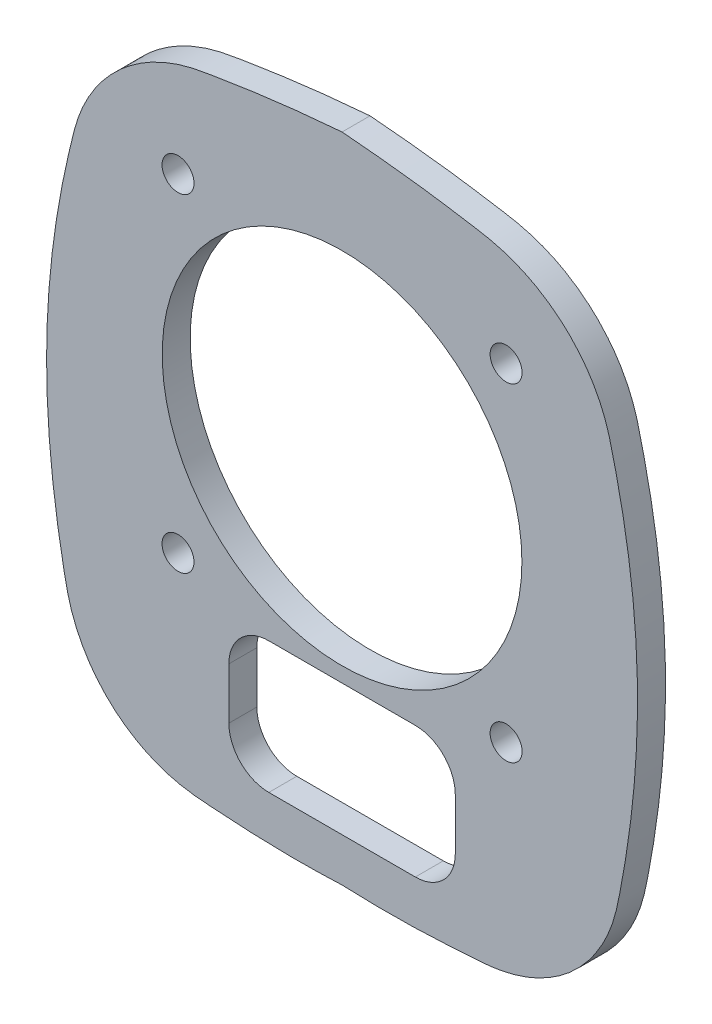
ISO-10303-21;
HEADER;
FILE_DESCRIPTION(('STEP AP214'),'2;1');
FILE_NAME('part.step','',(''),(''),'','','');
FILE_SCHEMA(('AUTOMOTIVE_DESIGN { 1 0 10303 214 1 1 1 1 }'));
ENDSEC;
DATA;
#1=APPLICATION_CONTEXT('core data for automotive mechanical design processes');
#2=APPLICATION_PROTOCOL_DEFINITION('international standard','automotive_design',2000,#1);
#3=PRODUCT_CONTEXT('',#1,'mechanical');
#4=PRODUCT('Part','Part','',(#3));
#5=PRODUCT_RELATED_PRODUCT_CATEGORY('part','',(#4));
#6=PRODUCT_DEFINITION_FORMATION('','',#4);
#7=PRODUCT_DEFINITION_CONTEXT('part definition',#1,'design');
#8=PRODUCT_DEFINITION('design','',#6,#7);
#9=PRODUCT_DEFINITION_SHAPE('','',#8);
#10=(LENGTH_UNIT() NAMED_UNIT(*) SI_UNIT(.MILLI.,.METRE.));
#11=(NAMED_UNIT(*) PLANE_ANGLE_UNIT() SI_UNIT($,.RADIAN.));
#12=(NAMED_UNIT(*) SI_UNIT($,.STERADIAN.) SOLID_ANGLE_UNIT());
#13=UNCERTAINTY_MEASURE_WITH_UNIT(LENGTH_MEASURE(1.E-05),#10,'distance_accuracy_value','');
#14=(GEOMETRIC_REPRESENTATION_CONTEXT(3) GLOBAL_UNCERTAINTY_ASSIGNED_CONTEXT((#13)) GLOBAL_UNIT_ASSIGNED_CONTEXT((#10,
#11,#12)) REPRESENTATION_CONTEXT('',''));
#15=CARTESIAN_POINT('',(0.,0.,0.));
#16=DIRECTION('',(0.,0.,1.));
#17=DIRECTION('',(1.,0.,0.));
#18=AXIS2_PLACEMENT_3D('',#15,#16,#17);
#19=CARTESIAN_POINT('',(29.5660110526599,98.2723507811862,1.4));
#20=DIRECTION('',(0.,0.,-1.));
#21=DIRECTION('',(-1.,0.,0.));
#22=AXIS2_PLACEMENT_3D('',#19,#20,#21);
#23=PLANE('',#22);
#24=CARTESIAN_POINT('',(16.4175490307704,87.21939598985,1.4));
#25=DIRECTION('',(0.,0.,1.));
#26=DIRECTION('',(-1.,0.,0.));
#27=AXIS2_PLACEMENT_3D('',#24,#25,#26);
#28=CIRCLE('',#27,1.6);
#29=CARTESIAN_POINT('',(14.8175490307704,87.21939598985,1.4));
#30=VERTEX_POINT('',#29);
#31=EDGE_CURVE('E207',#30,#30,#28,.T.);
#32=ORIENTED_EDGE('',*,*,#31,.F.);
#33=EDGE_LOOP('',(#32));
#34=FACE_BOUND('',#33,.T.);
#35=CARTESIAN_POINT('',(16.4175490307704,120.054494051391,1.4));
#36=DIRECTION('',(0.,0.,1.));
#37=DIRECTION('',(1.,0.,0.));
#38=AXIS2_PLACEMENT_3D('',#35,#36,#37);
#39=CIRCLE('',#38,1.6);
#40=CARTESIAN_POINT('',(18.0175490307704,120.054494051391,1.4));
#41=VERTEX_POINT('',#40);
#42=EDGE_CURVE('E215',#41,#41,#39,.T.);
#43=ORIENTED_EDGE('',*,*,#42,.F.);
#44=EDGE_LOOP('',(#43));
#45=FACE_BOUND('',#44,.T.);
#46=CARTESIAN_POINT('',(-16.4167663836786,87.21939598985,1.4));
#47=DIRECTION('',(0.,0.,1.));
#48=DIRECTION('',(1.,0.,0.));
#49=AXIS2_PLACEMENT_3D('',#46,#47,#48);
#50=CIRCLE('',#49,1.6);
#51=CARTESIAN_POINT('',(-14.8167663836786,87.21939598985,1.4));
#52=VERTEX_POINT('',#51);
#53=EDGE_CURVE('E223',#52,#52,#50,.T.);
#54=ORIENTED_EDGE('',*,*,#53,.F.);
#55=EDGE_LOOP('',(#54));
#56=FACE_BOUND('',#55,.T.);
#57=CARTESIAN_POINT('',(-16.4167663836786,120.054494051391,1.4));
#58=DIRECTION('',(0.,0.,1.));
#59=DIRECTION('',(-1.,0.,0.));
#60=AXIS2_PLACEMENT_3D('',#57,#58,#59);
#61=CIRCLE('',#60,1.6);
#62=CARTESIAN_POINT('',(-18.0167663836786,120.054494051391,1.4));
#63=VERTEX_POINT('',#62);
#64=EDGE_CURVE('E231',#63,#63,#61,.T.);
#65=ORIENTED_EDGE('',*,*,#64,.F.);
#66=EDGE_LOOP('',(#65));
#67=FACE_BOUND('',#66,.T.);
#68=CARTESIAN_POINT('',(0.,103.636945020621,1.4));
#69=DIRECTION('',(0.,0.,1.));
#70=DIRECTION('',(1.,0.,0.));
#71=AXIS2_PLACEMENT_3D('',#68,#69,#70);
#72=CIRCLE('',#71,18.);
#73=CARTESIAN_POINT('',(18.,103.636945020621,1.4));
#74=VERTEX_POINT('',#73);
#75=EDGE_CURVE('E239',#74,#74,#72,.T.);
#76=ORIENTED_EDGE('',*,*,#75,.F.);
#77=EDGE_LOOP('',(#76));
#78=FACE_BOUND('',#77,.T.);
#79=CARTESIAN_POINT('',(-0.00114590293324403,66.6423887461975,1.4));
#80=CARTESIAN_POINT('',(2.16948562826334,66.5419398633062,1.4));
#81=CARTESIAN_POINT('',(5.43385116812683,66.505280538818,1.4));
#82=CARTESIAN_POINT('',(9.77200299351558,66.6566452224753,1.4));
#83=CARTESIAN_POINT('',(12.4817460876061,66.8356540688409,1.4));
#84=CARTESIAN_POINT('',(14.637680558828,66.983895816478,1.4));
#85=CARTESIAN_POINT('',(16.9129124050583,67.3234824873819,1.4));
#86=CARTESIAN_POINT('',(19.6236468631734,68.2455656210694,1.4));
#87=CARTESIAN_POINT('',(22.5464740169098,70.0824830868816,1.4));
#88=CARTESIAN_POINT('',(24.9502766875692,72.5730299108774,1.4));
#89=CARTESIAN_POINT('',(26.3989798043547,75.0504166052951,1.4));
#90=CARTESIAN_POINT('',(27.2065581908342,77.1786683050761,1.4));
#91=CARTESIAN_POINT('',(27.6110183961039,78.8487852280131,1.4));
#92=CARTESIAN_POINT('',(27.9093681702662,80.4300199858868,1.4));
#93=CARTESIAN_POINT('',(28.3025005898399,82.5729718823645,1.4));
#94=CARTESIAN_POINT('',(28.7205415588727,85.2543199128912,1.4));
#95=CARTESIAN_POINT('',(29.1181558415916,88.4931280297747,1.4));
#96=CARTESIAN_POINT('',(29.4903901876357,92.8280904478494,1.4));
#97=CARTESIAN_POINT('',(29.654253142288,98.2732628435648,1.4));
#98=CARTESIAN_POINT('',(29.3769056487996,103.713874927387,1.4));
#99=CARTESIAN_POINT('',(28.8956423277796,108.042477970134,1.4));
#100=CARTESIAN_POINT('',(28.4052762156834,111.270056639962,1.4));
#101=CARTESIAN_POINT('',(27.7967621601101,114.480280638573,1.4));
#102=CARTESIAN_POINT('',(27.1834847934858,117.116721421864,1.4));
#103=CARTESIAN_POINT('',(26.6675524143798,119.250806558587,1.4));
#104=CARTESIAN_POINT('',(25.8901295661733,121.416071799771,1.4));
#105=CARTESIAN_POINT('',(24.4734859452568,123.902459514448,1.4));
#106=CARTESIAN_POINT('',(22.1547118273897,126.445270684915,1.4));
#107=CARTESIAN_POINT('',(19.342461396647,128.415820489186,1.4));
#108=CARTESIAN_POINT('',(16.7314740172919,129.527353104295,1.4));
#109=CARTESIAN_POINT('',(14.509433763638,130.079191823248,1.4));
#110=CARTESIAN_POINT('',(12.3644948862494,130.418554538151,1.4));
#111=CARTESIAN_POINT('',(9.69261830244954,130.848121131598,1.4));
#112=CARTESIAN_POINT('',(5.39273250940411,131.419070179077,1.4));
#113=CARTESIAN_POINT('',(2.15936510859775,131.732517865312,1.4));
#114=CARTESIAN_POINT('',(0.000391323545911014,131.908854892588,1.4));
#115=B_SPLINE_CURVE_WITH_KNOTS('',3,(#79,#80,#81,#82,#83,#84,#85,#86,#87,#88,#89,#90,#91,#92,
#93,#94,#95,#96,#97,#98,#99,#100,#101,#102,#103,#104,#105,#106,#107,#108,#109,#110,#111,#112,
#113,#114),.UNSPECIFIED.,.F.,.F.,(4,1,1,1,1,1,1,1,1,1,1,1,1,1,1,1,1,1,1,1,1,1,1,1,1,1,1,1,1,1,1,
1,1,4),(0.000346796991259824,0.0628643634976953,0.094123146750913,0.125381930004131,
0.14101132163074,0.156640713257348,0.187899496510566,0.219158279763784,0.250417063017002,
0.281675846270219,0.297305237896828,0.312934629523437,0.328564021150046,0.344193412776655,
0.375452196029872,0.40671097928309,0.437969762536308,0.500487329042743,0.563004895549179,
0.594263678802396,0.625522462055614,0.656781245308832,0.68804002856205,0.703669420188658,
0.719298811815267,0.750557595068485,0.781816378321703,0.813075161574921,0.844333944828138,
0.859963336454747,0.875592728081356,0.906851511334574,0.938110294587791,1.00062786109423),.UNSPECIFIED.);
#116=CARTESIAN_POINT('',(-0.00114590293391867,66.6423887461975,1.4));
#117=VERTEX_POINT('',#116);
#118=CARTESIAN_POINT('',(0.000391323546145079,131.908854892588,1.4));
#119=VERTEX_POINT('',#118);
#120=EDGE_CURVE('E246',#117,#119,#115,.T.);
#121=ORIENTED_EDGE('',*,*,#120,.T.);
#122=CARTESIAN_POINT('',(0.000391323546145079,131.908854892588,1.4));
#123=CARTESIAN_POINT('',(-2.1591261383784,131.7345930861,1.4));
#124=CARTESIAN_POINT('',(-5.39322742901257,131.418538240011,1.4));
#125=CARTESIAN_POINT('',(-9.69289483410496,130.848188184135,1.4));
#126=CARTESIAN_POINT('',(-12.3658250185179,130.418323908694,1.4));
#127=CARTESIAN_POINT('',(-14.5079914346973,130.079334896995,1.4));
#128=CARTESIAN_POINT('',(-16.7335790717156,129.5269106605,1.4));
#129=CARTESIAN_POINT('',(-19.3431914714866,128.415144728243,1.4));
#130=CARTESIAN_POINT('',(-22.1552988711551,126.445152242459,1.4));
#131=CARTESIAN_POINT('',(-24.4752364303285,123.899413855855,1.4));
#132=CARTESIAN_POINT('',(-25.887781921426,121.420218381764,1.4));
#133=CARTESIAN_POINT('',(-26.6662140206921,119.255985971513,1.4));
#134=CARTESIAN_POINT('',(-27.1828375186665,117.119607320457,1.4));
#135=CARTESIAN_POINT('',(-27.7958816228897,114.484316509087,1.4));
#136=CARTESIAN_POINT('',(-28.4047206131908,111.2734495972,1.4));
#137=CARTESIAN_POINT('',(-28.8951748287373,108.045870015957,1.4));
#138=CARTESIAN_POINT('',(-29.3766911011961,103.716956362817,1.4));
#139=CARTESIAN_POINT('',(-29.6542181670158,98.2761183571566,1.4));
#140=CARTESIAN_POINT('',(-29.4905112309064,92.8305844065659,1.4));
#141=CARTESIAN_POINT('',(-29.1184365267498,88.4954449681171,1.4));
#142=CARTESIAN_POINT('',(-28.7206832439652,85.256152796539,1.4));
#143=CARTESIAN_POINT('',(-28.3032264117914,82.5755819784739,1.4));
#144=CARTESIAN_POINT('',(-27.9089571505932,80.4308811818363,1.4));
#145=CARTESIAN_POINT('',(-27.6123180213739,78.8489960258506,1.4));
#146=CARTESIAN_POINT('',(-27.2069901770556,77.1815747696189,1.4));
#147=CARTESIAN_POINT('',(-26.3998073250248,75.0513159005706,1.4));
#148=CARTESIAN_POINT('',(-24.9513512481695,72.5746001415276,1.4));
#149=CARTESIAN_POINT('',(-22.5477231757786,70.0835207878265,1.4));
#150=CARTESIAN_POINT('',(-19.6247167325254,68.2459568509885,1.4));
#151=CARTESIAN_POINT('',(-16.9138564153532,67.3239214153239,1.4));
#152=CARTESIAN_POINT('',(-14.6389200212343,66.9838066691267,1.4));
#153=CARTESIAN_POINT('',(-12.4812620448513,66.8357081274828,1.4));
#154=CARTESIAN_POINT('',(-9.77299519971555,66.656339600391,1.4));
#155=CARTESIAN_POINT('',(-6.51861540533435,66.5443130204577,1.4));
#156=CARTESIAN_POINT('',(-3.25841317832526,66.5253695638279,1.4));
#157=CARTESIAN_POINT('',(-1.08648271210071,66.5952706153703,1.4));
#158=CARTESIAN_POINT('',(-0.00114590293391867,66.6423887461975,1.4));
#159=B_SPLINE_CURVE_WITH_KNOTS('',3,(#122,#123,#124,#125,#126,#127,#128,#129,#130,#131,#132,
#133,#134,#135,#136,#137,#138,#139,#140,#141,#142,#143,#144,#145,#146,#147,#148,#149,#150,#151,
#152,#153,#154,#155,#156,#157,#158),.UNSPECIFIED.,.F.,.F.,(4,1,1,1,1,1,1,1,1,1,1,1,1,1,1,1,1,1,
1,1,1,1,1,1,1,1,1,1,1,1,1,1,1,1,4),(-0.000627828320434477,0.0618897355672235,0.0931485175110524,
0.124407299454881,0.140036690426796,0.15566608139871,0.186924863342539,0.218183645286368,
0.249442427230197,0.280701209174026,0.296330600145941,0.311959991117855,0.343218773061684,
0.374477555005513,0.405736336949342,0.436995118893171,0.499512682780829,0.562030246668487,
0.593289028612316,0.624547810556145,0.655806592499974,0.671435983471888,0.687065374443803,
0.702694765415717,0.718324156387632,0.749582938331461,0.78084172027529,0.812100502219119,
0.843359284162948,0.858988675134862,0.874618066106777,0.905876848050606,0.937135629994435,
0.968394411938263,0.999653193882093),.UNSPECIFIED.);
#160=EDGE_CURVE('E253',#119,#117,#159,.T.);
#161=ORIENTED_EDGE('',*,*,#160,.T.);
#162=EDGE_LOOP('',(#121,#161));
#163=FACE_BOUND('',#162,.T.);
#164=CARTESIAN_POINT('',(7.33166518277673,80.1435470663297,1.4));
#165=DIRECTION('',(0.,0.,1.));
#166=DIRECTION('',(-1.,0.,0.));
#167=AXIS2_PLACEMENT_3D('',#164,#165,#166);
#168=CIRCLE('',#167,4.);
#169=CARTESIAN_POINT('',(11.3316651827767,80.1435470663297,1.4));
#170=VERTEX_POINT('',#169);
#171=CARTESIAN_POINT('',(7.3316651827767,84.1435470663297,1.4));
#172=VERTEX_POINT('',#171);
#173=EDGE_CURVE('E118',#170,#172,#168,.T.);
#174=ORIENTED_EDGE('',*,*,#173,.F.);
#175=DIRECTION('',(0.,1.,0.));
#176=VECTOR('',#175,1.);
#177=CARTESIAN_POINT('',(11.3316651827767,75.002350727066,1.4));
#178=LINE('',#177,#176);
#179=CARTESIAN_POINT('',(11.3316651827767,75.002350727066,1.4));
#180=VERTEX_POINT('',#179);
#181=EDGE_CURVE('E159',#180,#170,#178,.T.);
#182=ORIENTED_EDGE('',*,*,#181,.F.);
#183=CARTESIAN_POINT('',(7.33166518277673,75.002350727066,1.4));
#184=DIRECTION('',(0.,0.,1.));
#185=DIRECTION('',(1.,0.,0.));
#186=AXIS2_PLACEMENT_3D('',#183,#184,#185);
#187=CIRCLE('',#186,4.);
#188=CARTESIAN_POINT('',(7.3316651827767,71.002350727066,1.4));
#189=VERTEX_POINT('',#188);
#190=EDGE_CURVE('E156',#189,#180,#187,.T.);
#191=ORIENTED_EDGE('',*,*,#190,.F.);
#192=DIRECTION('',(1.,0.,0.));
#193=VECTOR('',#192,1.);
#194=CARTESIAN_POINT('',(-7.33088253568488,71.002350727066,1.4));
#195=LINE('',#194,#193);
#196=CARTESIAN_POINT('',(-7.33088253568488,71.002350727066,1.4));
#197=VERTEX_POINT('',#196);
#198=EDGE_CURVE('E153',#197,#189,#195,.T.);
#199=ORIENTED_EDGE('',*,*,#198,.F.);
#200=CARTESIAN_POINT('',(-7.33088253568491,75.002350727066,1.4));
#201=DIRECTION('',(0.,0.,1.));
#202=DIRECTION('',(-1.,0.,0.));
#203=AXIS2_PLACEMENT_3D('',#200,#201,#202);
#204=CIRCLE('',#203,4.);
#205=CARTESIAN_POINT('',(-11.3308825356849,75.002350727066,1.4));
#206=VERTEX_POINT('',#205);
#207=EDGE_CURVE('E150',#206,#197,#204,.T.);
#208=ORIENTED_EDGE('',*,*,#207,.F.);
#209=DIRECTION('',(0.,-1.,0.));
#210=VECTOR('',#209,1.);
#211=CARTESIAN_POINT('',(-11.3308825356849,75.002350727066,1.4));
#212=LINE('',#211,#210);
#213=CARTESIAN_POINT('',(-11.3308825356849,80.1435470663297,1.4));
#214=VERTEX_POINT('',#213);
#215=EDGE_CURVE('E145',#214,#206,#212,.T.);
#216=ORIENTED_EDGE('',*,*,#215,.F.);
#217=CARTESIAN_POINT('',(-7.33088253568491,80.1435470663297,1.4));
#218=DIRECTION('',(0.,0.,1.));
#219=DIRECTION('',(-1.,0.,0.));
#220=AXIS2_PLACEMENT_3D('',#217,#218,#219);
#221=CIRCLE('',#220,4.);
#222=CARTESIAN_POINT('',(-7.33088253568488,84.1435470663297,1.4));
#223=VERTEX_POINT('',#222);
#224=EDGE_CURVE('E141',#223,#214,#221,.T.);
#225=ORIENTED_EDGE('',*,*,#224,.F.);
#226=DIRECTION('',(-1.,0.,0.));
#227=VECTOR('',#226,1.);
#228=CARTESIAN_POINT('',(-7.33088253568488,84.1435470663297,1.4));
#229=LINE('',#228,#227);
#230=EDGE_CURVE('E127',#172,#223,#229,.T.);
#231=ORIENTED_EDGE('',*,*,#230,.F.);
#232=EDGE_LOOP('',(#174,#182,#191,#199,#208,#216,#225,#231));
#233=FACE_BOUND('',#232,.T.);
#234=ADVANCED_FACE('F39',(#34,#45,#56,#67,#78,#163,#233),#23,.F.);
#235=CARTESIAN_POINT('',(29.5660110526599,98.2723507811862,-1.4));
#236=DIRECTION('',(0.,0.,-1.));
#237=DIRECTION('',(-1.,0.,0.));
#238=AXIS2_PLACEMENT_3D('',#235,#236,#237);
#239=PLANE('',#238);
#240=CARTESIAN_POINT('',(16.4175490307704,120.054494051391,-1.4));
#241=DIRECTION('',(0.,0.,1.));
#242=DIRECTION('',(1.,0.,0.));
#243=AXIS2_PLACEMENT_3D('',#240,#241,#242);
#244=CIRCLE('',#243,1.6);
#245=CARTESIAN_POINT('',(18.0175490307704,120.054494051391,-1.4));
#246=VERTEX_POINT('',#245);
#247=EDGE_CURVE('E211',#246,#246,#244,.T.);
#248=ORIENTED_EDGE('',*,*,#247,.T.);
#249=EDGE_LOOP('',(#248));
#250=FACE_BOUND('',#249,.T.);
#251=CARTESIAN_POINT('',(-16.4167663836786,120.054494051391,-1.4));
#252=DIRECTION('',(0.,0.,1.));
#253=DIRECTION('',(-1.,0.,0.));
#254=AXIS2_PLACEMENT_3D('',#251,#252,#253);
#255=CIRCLE('',#254,1.6);
#256=CARTESIAN_POINT('',(-18.0167663836786,120.054494051391,-1.4));
#257=VERTEX_POINT('',#256);
#258=EDGE_CURVE('E227',#257,#257,#255,.T.);
#259=ORIENTED_EDGE('',*,*,#258,.T.);
#260=EDGE_LOOP('',(#259));
#261=FACE_BOUND('',#260,.T.);
#262=CARTESIAN_POINT('',(-0.00114590293324403,66.6423887461975,-1.4));
#263=CARTESIAN_POINT('',(2.16948562826334,66.5419398633062,-1.4));
#264=CARTESIAN_POINT('',(5.43385116812683,66.505280538818,-1.4));
#265=CARTESIAN_POINT('',(9.77200299351558,66.6566452224753,-1.4));
#266=CARTESIAN_POINT('',(12.4817460876061,66.8356540688409,-1.4));
#267=CARTESIAN_POINT('',(14.637680558828,66.983895816478,-1.4));
#268=CARTESIAN_POINT('',(16.9129124050583,67.3234824873819,-1.4));
#269=CARTESIAN_POINT('',(19.6236468631734,68.2455656210694,-1.4));
#270=CARTESIAN_POINT('',(22.5464740169098,70.0824830868816,-1.4));
#271=CARTESIAN_POINT('',(24.9502766875692,72.5730299108774,-1.4));
#272=CARTESIAN_POINT('',(26.3989798043547,75.0504166052951,-1.4));
#273=CARTESIAN_POINT('',(27.2065581908342,77.1786683050761,-1.4));
#274=CARTESIAN_POINT('',(27.6110183961039,78.8487852280131,-1.4));
#275=CARTESIAN_POINT('',(27.9093681702662,80.4300199858868,-1.4));
#276=CARTESIAN_POINT('',(28.3025005898399,82.5729718823645,-1.4));
#277=CARTESIAN_POINT('',(28.7205415588727,85.2543199128912,-1.4));
#278=CARTESIAN_POINT('',(29.1181558415916,88.4931280297747,-1.4));
#279=CARTESIAN_POINT('',(29.4903901876357,92.8280904478494,-1.4));
#280=CARTESIAN_POINT('',(29.654253142288,98.2732628435648,-1.4));
#281=CARTESIAN_POINT('',(29.3769056487996,103.713874927387,-1.4));
#282=CARTESIAN_POINT('',(28.8956423277796,108.042477970134,-1.4));
#283=CARTESIAN_POINT('',(28.4052762156834,111.270056639962,-1.4));
#284=CARTESIAN_POINT('',(27.7967621601101,114.480280638573,-1.4));
#285=CARTESIAN_POINT('',(27.1834847934858,117.116721421864,-1.4));
#286=CARTESIAN_POINT('',(26.6675524143798,119.250806558587,-1.4));
#287=CARTESIAN_POINT('',(25.8901295661733,121.416071799771,-1.4));
#288=CARTESIAN_POINT('',(24.4734859452568,123.902459514448,-1.4));
#289=CARTESIAN_POINT('',(22.1547118273897,126.445270684915,-1.4));
#290=CARTESIAN_POINT('',(19.342461396647,128.415820489186,-1.4));
#291=CARTESIAN_POINT('',(16.7314740172919,129.527353104295,-1.4));
#292=CARTESIAN_POINT('',(14.509433763638,130.079191823248,-1.4));
#293=CARTESIAN_POINT('',(12.3644948862494,130.418554538151,-1.4));
#294=CARTESIAN_POINT('',(9.69261830244954,130.848121131598,-1.4));
#295=CARTESIAN_POINT('',(5.39273250940411,131.419070179077,-1.4));
#296=CARTESIAN_POINT('',(2.15936510859775,131.732517865312,-1.4));
#297=CARTESIAN_POINT('',(0.000391323545911014,131.908854892588,-1.4));
#298=B_SPLINE_CURVE_WITH_KNOTS('',3,(#262,#263,#264,#265,#266,#267,#268,#269,#270,#271,#272,
#273,#274,#275,#276,#277,#278,#279,#280,#281,#282,#283,#284,#285,#286,#287,#288,#289,#290,#291,
#292,#293,#294,#295,#296,#297),.UNSPECIFIED.,.F.,.F.,(4,1,1,1,1,1,1,1,1,1,1,1,1,1,1,1,1,1,1,1,1,
1,1,1,1,1,1,1,1,1,1,1,1,4),(0.000346796991259824,0.0628643634976953,0.094123146750913,
0.125381930004131,0.14101132163074,0.156640713257348,0.187899496510566,0.219158279763784,
0.250417063017002,0.281675846270219,0.297305237896828,0.312934629523437,0.328564021150046,
0.344193412776655,0.375452196029872,0.40671097928309,0.437969762536308,0.500487329042743,
0.563004895549179,0.594263678802396,0.625522462055614,0.656781245308832,0.68804002856205,
0.703669420188658,0.719298811815267,0.750557595068485,0.781816378321703,0.813075161574921,
0.844333944828138,0.859963336454747,0.875592728081356,0.906851511334574,0.938110294587791,
1.00062786109423),.UNSPECIFIED.);
#299=CARTESIAN_POINT('',(-0.00114590293391867,66.6423887461975,-1.4));
#300=VERTEX_POINT('',#299);
#301=CARTESIAN_POINT('',(0.000391323546145079,131.908854892588,-1.4));
#302=VERTEX_POINT('',#301);
#303=EDGE_CURVE('E243',#300,#302,#298,.T.);
#304=ORIENTED_EDGE('',*,*,#303,.F.);
#305=CARTESIAN_POINT('',(0.000391323546145079,131.908854892588,-1.4));
#306=CARTESIAN_POINT('',(-2.1591261383784,131.7345930861,-1.4));
#307=CARTESIAN_POINT('',(-5.39322742901257,131.418538240011,-1.4));
#308=CARTESIAN_POINT('',(-9.69289483410496,130.848188184135,-1.4));
#309=CARTESIAN_POINT('',(-12.3658250185179,130.418323908694,-1.4));
#310=CARTESIAN_POINT('',(-14.5079914346973,130.079334896995,-1.4));
#311=CARTESIAN_POINT('',(-16.7335790717156,129.5269106605,-1.4));
#312=CARTESIAN_POINT('',(-19.3431914714866,128.415144728243,-1.4));
#313=CARTESIAN_POINT('',(-22.1552988711551,126.445152242459,-1.4));
#314=CARTESIAN_POINT('',(-24.4752364303285,123.899413855855,-1.4));
#315=CARTESIAN_POINT('',(-25.887781921426,121.420218381764,-1.4));
#316=CARTESIAN_POINT('',(-26.6662140206921,119.255985971513,-1.4));
#317=CARTESIAN_POINT('',(-27.1828375186665,117.119607320457,-1.4));
#318=CARTESIAN_POINT('',(-27.7958816228897,114.484316509087,-1.4));
#319=CARTESIAN_POINT('',(-28.4047206131908,111.2734495972,-1.4));
#320=CARTESIAN_POINT('',(-28.8951748287373,108.045870015957,-1.4));
#321=CARTESIAN_POINT('',(-29.3766911011961,103.716956362817,-1.4));
#322=CARTESIAN_POINT('',(-29.6542181670158,98.2761183571566,-1.4));
#323=CARTESIAN_POINT('',(-29.4905112309064,92.8305844065659,-1.4));
#324=CARTESIAN_POINT('',(-29.1184365267498,88.4954449681171,-1.4));
#325=CARTESIAN_POINT('',(-28.7206832439652,85.256152796539,-1.4));
#326=CARTESIAN_POINT('',(-28.3032264117914,82.5755819784739,-1.4));
#327=CARTESIAN_POINT('',(-27.9089571505932,80.4308811818363,-1.4));
#328=CARTESIAN_POINT('',(-27.6123180213739,78.8489960258506,-1.4));
#329=CARTESIAN_POINT('',(-27.2069901770556,77.1815747696189,-1.4));
#330=CARTESIAN_POINT('',(-26.3998073250248,75.0513159005706,-1.4));
#331=CARTESIAN_POINT('',(-24.9513512481695,72.5746001415276,-1.4));
#332=CARTESIAN_POINT('',(-22.5477231757786,70.0835207878265,-1.4));
#333=CARTESIAN_POINT('',(-19.6247167325254,68.2459568509885,-1.4));
#334=CARTESIAN_POINT('',(-16.9138564153532,67.3239214153239,-1.4));
#335=CARTESIAN_POINT('',(-14.6389200212343,66.9838066691267,-1.4));
#336=CARTESIAN_POINT('',(-12.4812620448513,66.8357081274828,-1.4));
#337=CARTESIAN_POINT('',(-9.77299519971555,66.656339600391,-1.4));
#338=CARTESIAN_POINT('',(-6.51861540533435,66.5443130204577,-1.4));
#339=CARTESIAN_POINT('',(-3.25841317832526,66.5253695638279,-1.4));
#340=CARTESIAN_POINT('',(-1.08648271210071,66.5952706153703,-1.4));
#341=CARTESIAN_POINT('',(-0.00114590293391867,66.6423887461975,-1.4));
#342=B_SPLINE_CURVE_WITH_KNOTS('',3,(#305,#306,#307,#308,#309,#310,#311,#312,#313,#314,#315,
#316,#317,#318,#319,#320,#321,#322,#323,#324,#325,#326,#327,#328,#329,#330,#331,#332,#333,#334,
#335,#336,#337,#338,#339,#340,#341),.UNSPECIFIED.,.F.,.F.,(4,1,1,1,1,1,1,1,1,1,1,1,1,1,1,1,1,1,
1,1,1,1,1,1,1,1,1,1,1,1,1,1,1,1,4),(-0.000627828320434477,0.0618897355672235,0.0931485175110524,
0.124407299454881,0.140036690426796,0.15566608139871,0.186924863342539,0.218183645286368,
0.249442427230197,0.280701209174026,0.296330600145941,0.311959991117855,0.343218773061684,
0.374477555005513,0.405736336949342,0.436995118893171,0.499512682780829,0.562030246668487,
0.593289028612316,0.624547810556145,0.655806592499974,0.671435983471888,0.687065374443803,
0.702694765415717,0.718324156387632,0.749582938331461,0.78084172027529,0.812100502219119,
0.843359284162948,0.858988675134862,0.874618066106777,0.905876848050606,0.937135629994435,
0.968394411938263,0.999653193882093),.UNSPECIFIED.);
#343=EDGE_CURVE('E254',#302,#300,#342,.T.);
#344=ORIENTED_EDGE('',*,*,#343,.F.);
#345=EDGE_LOOP('',(#304,#344));
#346=FACE_BOUND('',#345,.T.);
#347=CARTESIAN_POINT('',(0.,103.636945020621,-1.4));
#348=DIRECTION('',(0.,0.,1.));
#349=DIRECTION('',(1.,0.,0.));
#350=AXIS2_PLACEMENT_3D('',#347,#348,#349);
#351=CIRCLE('',#350,18.);
#352=CARTESIAN_POINT('',(18.,103.636945020621,-1.4));
#353=VERTEX_POINT('',#352);
#354=EDGE_CURVE('E235',#353,#353,#351,.T.);
#355=ORIENTED_EDGE('',*,*,#354,.T.);
#356=EDGE_LOOP('',(#355));
#357=FACE_BOUND('',#356,.T.);
#358=CARTESIAN_POINT('',(-16.4167663836786,87.21939598985,-1.4));
#359=DIRECTION('',(0.,0.,1.));
#360=DIRECTION('',(1.,0.,0.));
#361=AXIS2_PLACEMENT_3D('',#358,#359,#360);
#362=CIRCLE('',#361,1.6);
#363=CARTESIAN_POINT('',(-14.8167663836786,87.21939598985,-1.4));
#364=VERTEX_POINT('',#363);
#365=EDGE_CURVE('E219',#364,#364,#362,.T.);
#366=ORIENTED_EDGE('',*,*,#365,.T.);
#367=EDGE_LOOP('',(#366));
#368=FACE_BOUND('',#367,.T.);
#369=CARTESIAN_POINT('',(16.4175490307704,87.21939598985,-1.4));
#370=DIRECTION('',(0.,0.,1.));
#371=DIRECTION('',(-1.,0.,0.));
#372=AXIS2_PLACEMENT_3D('',#369,#370,#371);
#373=CIRCLE('',#372,1.6);
#374=CARTESIAN_POINT('',(14.8175490307704,87.21939598985,-1.4));
#375=VERTEX_POINT('',#374);
#376=EDGE_CURVE('E136',#375,#375,#373,.T.);
#377=ORIENTED_EDGE('',*,*,#376,.T.);
#378=EDGE_LOOP('',(#377));
#379=FACE_BOUND('',#378,.T.);
#380=DIRECTION('',(0.,1.,0.));
#381=VECTOR('',#380,1.);
#382=CARTESIAN_POINT('',(11.3316651827767,75.002350727066,-1.4));
#383=LINE('',#382,#381);
#384=CARTESIAN_POINT('',(11.3316651827767,75.002350727066,-1.4));
#385=VERTEX_POINT('',#384);
#386=CARTESIAN_POINT('',(11.3316651827767,80.1435470663297,-1.4));
#387=VERTEX_POINT('',#386);
#388=EDGE_CURVE('E128',#385,#387,#383,.T.);
#389=ORIENTED_EDGE('',*,*,#388,.T.);
#390=CARTESIAN_POINT('',(7.33166518277673,80.1435470663297,-1.4));
#391=DIRECTION('',(0.,0.,1.));
#392=DIRECTION('',(-1.,0.,0.));
#393=AXIS2_PLACEMENT_3D('',#390,#391,#392);
#394=CIRCLE('',#393,4.);
#395=CARTESIAN_POINT('',(7.3316651827767,84.1435470663297,-1.4));
#396=VERTEX_POINT('',#395);
#397=EDGE_CURVE('E64',#387,#396,#394,.T.);
#398=ORIENTED_EDGE('',*,*,#397,.T.);
#399=DIRECTION('',(-1.,0.,0.));
#400=VECTOR('',#399,1.);
#401=CARTESIAN_POINT('',(-7.33088253568488,84.1435470663297,-1.4));
#402=LINE('',#401,#400);
#403=CARTESIAN_POINT('',(-7.33088253568488,84.1435470663297,-1.4));
#404=VERTEX_POINT('',#403);
#405=EDGE_CURVE('E134',#396,#404,#402,.T.);
#406=ORIENTED_EDGE('',*,*,#405,.T.);
#407=CARTESIAN_POINT('',(-7.33088253568491,80.1435470663297,-1.4));
#408=DIRECTION('',(0.,0.,1.));
#409=DIRECTION('',(-1.,0.,0.));
#410=AXIS2_PLACEMENT_3D('',#407,#408,#409);
#411=CIRCLE('',#410,4.);
#412=CARTESIAN_POINT('',(-11.3308825356849,80.1435470663297,-1.4));
#413=VERTEX_POINT('',#412);
#414=EDGE_CURVE('E166',#404,#413,#411,.T.);
#415=ORIENTED_EDGE('',*,*,#414,.T.);
#416=DIRECTION('',(0.,-1.,0.));
#417=VECTOR('',#416,1.);
#418=CARTESIAN_POINT('',(-11.3308825356849,75.002350727066,-1.4));
#419=LINE('',#418,#417);
#420=CARTESIAN_POINT('',(-11.3308825356849,75.002350727066,-1.4));
#421=VERTEX_POINT('',#420);
#422=EDGE_CURVE('E170',#413,#421,#419,.T.);
#423=ORIENTED_EDGE('',*,*,#422,.T.);
#424=CARTESIAN_POINT('',(-7.33088253568491,75.002350727066,-1.4));
#425=DIRECTION('',(0.,0.,1.));
#426=DIRECTION('',(-1.,0.,0.));
#427=AXIS2_PLACEMENT_3D('',#424,#425,#426);
#428=CIRCLE('',#427,4.);
#429=CARTESIAN_POINT('',(-7.33088253568488,71.002350727066,-1.4));
#430=VERTEX_POINT('',#429);
#431=EDGE_CURVE('E174',#421,#430,#428,.T.);
#432=ORIENTED_EDGE('',*,*,#431,.T.);
#433=DIRECTION('',(1.,0.,0.));
#434=VECTOR('',#433,1.);
#435=CARTESIAN_POINT('',(-7.33088253568488,71.002350727066,-1.4));
#436=LINE('',#435,#434);
#437=CARTESIAN_POINT('',(7.3316651827767,71.002350727066,-1.4));
#438=VERTEX_POINT('',#437);
#439=EDGE_CURVE('E178',#430,#438,#436,.T.);
#440=ORIENTED_EDGE('',*,*,#439,.T.);
#441=CARTESIAN_POINT('',(7.33166518277673,75.002350727066,-1.4));
#442=DIRECTION('',(0.,0.,1.));
#443=DIRECTION('',(1.,0.,0.));
#444=AXIS2_PLACEMENT_3D('',#441,#442,#443);
#445=CIRCLE('',#444,4.);
#446=EDGE_CURVE('E182',#438,#385,#445,.T.);
#447=ORIENTED_EDGE('',*,*,#446,.T.);
#448=EDGE_LOOP('',(#389,#398,#406,#415,#423,#432,#440,#447));
#449=FACE_BOUND('',#448,.T.);
#450=ADVANCED_FACE('F274',(#250,#261,#346,#357,#368,#379,#449),#239,.T.);
#451=DIRECTION('',(0.,0.,-1.));
#452=VECTOR('',#451,1.);
#453=SURFACE_OF_LINEAR_EXTRUSION('',#115,#452);
#454=ORIENTED_EDGE('',*,*,#303,.T.);
#455=DIRECTION('',(0.,0.,-1.));
#456=VECTOR('',#455,1.);
#457=CARTESIAN_POINT('',(0.000391323546145079,131.908854892588,1.4));
#458=LINE('',#457,#456);
#459=EDGE_CURVE('E11',#119,#302,#458,.T.);
#460=ORIENTED_EDGE('',*,*,#459,.F.);
#461=ORIENTED_EDGE('',*,*,#120,.F.);
#462=DIRECTION('',(0.,0.,-1.));
#463=VECTOR('',#462,1.);
#464=CARTESIAN_POINT('',(-0.00114590293391867,66.6423887461975,1.4));
#465=LINE('',#464,#463);
#466=EDGE_CURVE('E49',#117,#300,#465,.T.);
#467=ORIENTED_EDGE('',*,*,#466,.T.);
#468=EDGE_LOOP('',(#454,#460,#461,#467));
#469=FACE_BOUND('',#468,.T.);
#470=ADVANCED_FACE('F41',(#469),#453,.F.);
#471=DIRECTION('',(0.,0.,-1.));
#472=VECTOR('',#471,1.);
#473=SURFACE_OF_LINEAR_EXTRUSION('',#159,#472);
#474=ORIENTED_EDGE('',*,*,#343,.T.);
#475=ORIENTED_EDGE('',*,*,#466,.F.);
#476=ORIENTED_EDGE('',*,*,#160,.F.);
#477=ORIENTED_EDGE('',*,*,#459,.T.);
#478=EDGE_LOOP('',(#474,#475,#476,#477));
#479=FACE_BOUND('',#478,.T.);
#480=ADVANCED_FACE('F269',(#479),#473,.F.);
#481=CARTESIAN_POINT('',(0.,103.636945020621,1.4));
#482=DIRECTION('',(0.,0.,-1.));
#483=DIRECTION('',(-1.,0.,0.));
#484=AXIS2_PLACEMENT_3D('',#481,#482,#483);
#485=CYLINDRICAL_SURFACE('',#484,18.);
#486=ORIENTED_EDGE('',*,*,#75,.T.);
#487=EDGE_LOOP('',(#486));
#488=FACE_BOUND('',#487,.T.);
#489=ORIENTED_EDGE('',*,*,#354,.F.);
#490=EDGE_LOOP('',(#489));
#491=FACE_BOUND('',#490,.T.);
#492=ADVANCED_FACE('F272',(#488,#491),#485,.F.);
#493=CARTESIAN_POINT('',(-16.4167663836786,120.054494051391,1.4));
#494=DIRECTION('',(0.,0.,-1.));
#495=DIRECTION('',(-1.,0.,0.));
#496=AXIS2_PLACEMENT_3D('',#493,#494,#495);
#497=CYLINDRICAL_SURFACE('',#496,1.6);
#498=ORIENTED_EDGE('',*,*,#64,.T.);
#499=EDGE_LOOP('',(#498));
#500=FACE_BOUND('',#499,.T.);
#501=ORIENTED_EDGE('',*,*,#258,.F.);
#502=EDGE_LOOP('',(#501));
#503=FACE_BOUND('',#502,.T.);
#504=ADVANCED_FACE('F283',(#500,#503),#497,.F.);
#505=CARTESIAN_POINT('',(-16.4167663836786,87.21939598985,1.4));
#506=DIRECTION('',(0.,0.,-1.));
#507=DIRECTION('',(-1.,0.,0.));
#508=AXIS2_PLACEMENT_3D('',#505,#506,#507);
#509=CYLINDRICAL_SURFACE('',#508,1.6);
#510=ORIENTED_EDGE('',*,*,#53,.T.);
#511=EDGE_LOOP('',(#510));
#512=FACE_BOUND('',#511,.T.);
#513=ORIENTED_EDGE('',*,*,#365,.F.);
#514=EDGE_LOOP('',(#513));
#515=FACE_BOUND('',#514,.T.);
#516=ADVANCED_FACE('F287',(#512,#515),#509,.F.);
#517=CARTESIAN_POINT('',(16.4175490307704,120.054494051391,1.4));
#518=DIRECTION('',(0.,0.,-1.));
#519=DIRECTION('',(-1.,0.,0.));
#520=AXIS2_PLACEMENT_3D('',#517,#518,#519);
#521=CYLINDRICAL_SURFACE('',#520,1.6);
#522=ORIENTED_EDGE('',*,*,#42,.T.);
#523=EDGE_LOOP('',(#522));
#524=FACE_BOUND('',#523,.T.);
#525=ORIENTED_EDGE('',*,*,#247,.F.);
#526=EDGE_LOOP('',(#525));
#527=FACE_BOUND('',#526,.T.);
#528=ADVANCED_FACE('F291',(#524,#527),#521,.F.);
#529=CARTESIAN_POINT('',(16.4175490307704,87.21939598985,1.4));
#530=DIRECTION('',(0.,0.,-1.));
#531=DIRECTION('',(-1.,0.,0.));
#532=AXIS2_PLACEMENT_3D('',#529,#530,#531);
#533=CYLINDRICAL_SURFACE('',#532,1.6);
#534=ORIENTED_EDGE('',*,*,#31,.T.);
#535=EDGE_LOOP('',(#534));
#536=FACE_BOUND('',#535,.T.);
#537=ORIENTED_EDGE('',*,*,#376,.F.);
#538=EDGE_LOOP('',(#537));
#539=FACE_BOUND('',#538,.T.);
#540=ADVANCED_FACE('F295',(#536,#539),#533,.F.);
#541=CARTESIAN_POINT('',(7.33166518277673,80.1435470663297,1.4));
#542=DIRECTION('',(0.,0.,-1.));
#543=DIRECTION('',(-1.,0.,0.));
#544=AXIS2_PLACEMENT_3D('',#541,#542,#543);
#545=CYLINDRICAL_SURFACE('',#544,4.);
#546=ORIENTED_EDGE('',*,*,#397,.F.);
#547=DIRECTION('',(0.,0.,-1.));
#548=VECTOR('',#547,1.);
#549=CARTESIAN_POINT('',(11.3316651827767,80.1435470663297,1.4));
#550=LINE('',#549,#548);
#551=EDGE_CURVE('E122',#170,#387,#550,.T.);
#552=ORIENTED_EDGE('',*,*,#551,.F.);
#553=ORIENTED_EDGE('',*,*,#173,.T.);
#554=DIRECTION('',(0.,0.,-1.));
#555=VECTOR('',#554,1.);
#556=CARTESIAN_POINT('',(7.3316651827767,84.1435470663297,1.4));
#557=LINE('',#556,#555);
#558=EDGE_CURVE('E121',#172,#396,#557,.T.);
#559=ORIENTED_EDGE('',*,*,#558,.T.);
#560=EDGE_LOOP('',(#546,#552,#553,#559));
#561=FACE_BOUND('',#560,.T.);
#562=ADVANCED_FACE('F120',(#561),#545,.F.);
#563=CARTESIAN_POINT('',(-7.33088253568488,84.1435470663297,1.4));
#564=DIRECTION('',(0.,-1.,0.));
#565=DIRECTION('',(0.,0.,-1.));
#566=AXIS2_PLACEMENT_3D('',#563,#564,#565);
#567=PLANE('',#566);
#568=ORIENTED_EDGE('',*,*,#405,.F.);
#569=ORIENTED_EDGE('',*,*,#558,.F.);
#570=ORIENTED_EDGE('',*,*,#230,.T.);
#571=DIRECTION('',(0.,0.,-1.));
#572=VECTOR('',#571,1.);
#573=CARTESIAN_POINT('',(-7.33088253568488,84.1435470663297,1.4));
#574=LINE('',#573,#572);
#575=EDGE_CURVE('E137',#223,#404,#574,.T.);
#576=ORIENTED_EDGE('',*,*,#575,.T.);
#577=EDGE_LOOP('',(#568,#569,#570,#576));
#578=FACE_BOUND('',#577,.T.);
#579=ADVANCED_FACE('F131',(#578),#567,.T.);
#580=CARTESIAN_POINT('',(-7.33088253568491,80.1435470663297,1.4));
#581=DIRECTION('',(0.,0.,-1.));
#582=DIRECTION('',(-1.,0.,0.));
#583=AXIS2_PLACEMENT_3D('',#580,#581,#582);
#584=CYLINDRICAL_SURFACE('',#583,4.);
#585=ORIENTED_EDGE('',*,*,#414,.F.);
#586=ORIENTED_EDGE('',*,*,#575,.F.);
#587=ORIENTED_EDGE('',*,*,#224,.T.);
#588=DIRECTION('',(0.,0.,-1.));
#589=VECTOR('',#588,1.);
#590=CARTESIAN_POINT('',(-11.3308825356849,80.1435470663297,1.4));
#591=LINE('',#590,#589);
#592=EDGE_CURVE('E202',#214,#413,#591,.T.);
#593=ORIENTED_EDGE('',*,*,#592,.T.);
#594=EDGE_LOOP('',(#585,#586,#587,#593));
#595=FACE_BOUND('',#594,.T.);
#596=ADVANCED_FACE('F304',(#595),#584,.F.);
#597=CARTESIAN_POINT('',(-11.3308825356849,75.002350727066,1.4));
#598=DIRECTION('',(1.,0.,0.));
#599=DIRECTION('',(0.,0.,-1.));
#600=AXIS2_PLACEMENT_3D('',#597,#598,#599);
#601=PLANE('',#600);
#602=ORIENTED_EDGE('',*,*,#422,.F.);
#603=ORIENTED_EDGE('',*,*,#592,.F.);
#604=ORIENTED_EDGE('',*,*,#215,.T.);
#605=DIRECTION('',(0.,0.,-1.));
#606=VECTOR('',#605,1.);
#607=CARTESIAN_POINT('',(-11.3308825356849,75.002350727066,1.4));
#608=LINE('',#607,#606);
#609=EDGE_CURVE('E199',#206,#421,#608,.T.);
#610=ORIENTED_EDGE('',*,*,#609,.T.);
#611=EDGE_LOOP('',(#602,#603,#604,#610));
#612=FACE_BOUND('',#611,.T.);
#613=ADVANCED_FACE('F307',(#612),#601,.T.);
#614=CARTESIAN_POINT('',(-7.33088253568491,75.002350727066,1.4));
#615=DIRECTION('',(0.,0.,-1.));
#616=DIRECTION('',(-1.,0.,0.));
#617=AXIS2_PLACEMENT_3D('',#614,#615,#616);
#618=CYLINDRICAL_SURFACE('',#617,4.);
#619=ORIENTED_EDGE('',*,*,#431,.F.);
#620=ORIENTED_EDGE('',*,*,#609,.F.);
#621=ORIENTED_EDGE('',*,*,#207,.T.);
#622=DIRECTION('',(0.,0.,-1.));
#623=VECTOR('',#622,1.);
#624=CARTESIAN_POINT('',(-7.33088253568488,71.002350727066,1.4));
#625=LINE('',#624,#623);
#626=EDGE_CURVE('E196',#197,#430,#625,.T.);
#627=ORIENTED_EDGE('',*,*,#626,.T.);
#628=EDGE_LOOP('',(#619,#620,#621,#627));
#629=FACE_BOUND('',#628,.T.);
#630=ADVANCED_FACE('F311',(#629),#618,.F.);
#631=CARTESIAN_POINT('',(-7.33088253568488,71.002350727066,1.4));
#632=DIRECTION('',(0.,1.,0.));
#633=DIRECTION('',(0.,0.,1.));
#634=AXIS2_PLACEMENT_3D('',#631,#632,#633);
#635=PLANE('',#634);
#636=ORIENTED_EDGE('',*,*,#439,.F.);
#637=ORIENTED_EDGE('',*,*,#626,.F.);
#638=ORIENTED_EDGE('',*,*,#198,.T.);
#639=DIRECTION('',(0.,0.,-1.));
#640=VECTOR('',#639,1.);
#641=CARTESIAN_POINT('',(7.3316651827767,71.002350727066,1.4));
#642=LINE('',#641,#640);
#643=EDGE_CURVE('E193',#189,#438,#642,.T.);
#644=ORIENTED_EDGE('',*,*,#643,.T.);
#645=EDGE_LOOP('',(#636,#637,#638,#644));
#646=FACE_BOUND('',#645,.T.);
#647=ADVANCED_FACE('F315',(#646),#635,.T.);
#648=CARTESIAN_POINT('',(7.33166518277673,75.002350727066,1.4));
#649=DIRECTION('',(0.,0.,-1.));
#650=DIRECTION('',(-1.,0.,0.));
#651=AXIS2_PLACEMENT_3D('',#648,#649,#650);
#652=CYLINDRICAL_SURFACE('',#651,4.);
#653=ORIENTED_EDGE('',*,*,#446,.F.);
#654=ORIENTED_EDGE('',*,*,#643,.F.);
#655=ORIENTED_EDGE('',*,*,#190,.T.);
#656=DIRECTION('',(0.,0.,-1.));
#657=VECTOR('',#656,1.);
#658=CARTESIAN_POINT('',(11.3316651827767,75.002350727066,1.4));
#659=LINE('',#658,#657);
#660=EDGE_CURVE('E56',#180,#385,#659,.T.);
#661=ORIENTED_EDGE('',*,*,#660,.T.);
#662=EDGE_LOOP('',(#653,#654,#655,#661));
#663=FACE_BOUND('',#662,.T.);
#664=ADVANCED_FACE('F319',(#663),#652,.F.);
#665=CARTESIAN_POINT('',(11.3316651827767,75.002350727066,1.4));
#666=DIRECTION('',(-1.,0.,0.));
#667=DIRECTION('',(0.,0.,1.));
#668=AXIS2_PLACEMENT_3D('',#665,#666,#667);
#669=PLANE('',#668);
#670=ORIENTED_EDGE('',*,*,#388,.F.);
#671=ORIENTED_EDGE('',*,*,#660,.F.);
#672=ORIENTED_EDGE('',*,*,#181,.T.);
#673=ORIENTED_EDGE('',*,*,#551,.T.);
#674=EDGE_LOOP('',(#670,#671,#672,#673));
#675=FACE_BOUND('',#674,.T.);
#676=ADVANCED_FACE('F323',(#675),#669,.T.);
#677=CLOSED_SHELL('',(#234,#450,#470,#480,#492,#504,#516,#528,#540,#562,#579,#596,#613,#630,
#647,#664,#676));
#678=MANIFOLD_SOLID_BREP('B2',#677);
#679=ADVANCED_BREP_SHAPE_REPRESENTATION('',(#18,#678),#14);
#680=SHAPE_DEFINITION_REPRESENTATION(#9,#679);
ENDSEC;
END-ISO-10303-21;
